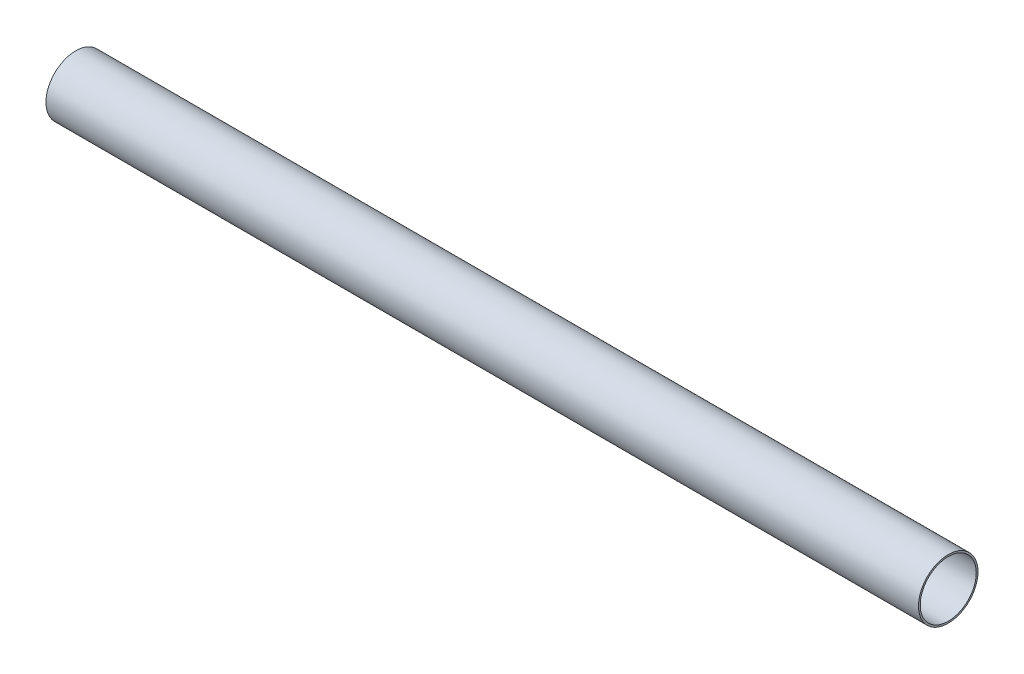
ISO-10303-21;
HEADER;
FILE_DESCRIPTION(('STEP AP214'),'2;1');
FILE_NAME('part.step','',(''),(''),'','','');
FILE_SCHEMA(('AUTOMOTIVE_DESIGN { 1 0 10303 214 1 1 1 1 }'));
ENDSEC;
DATA;
#1=APPLICATION_CONTEXT('core data for automotive mechanical design processes');
#2=APPLICATION_PROTOCOL_DEFINITION('international standard','automotive_design',2000,#1);
#3=PRODUCT_CONTEXT('',#1,'mechanical');
#4=PRODUCT('Part','Part','',(#3));
#5=PRODUCT_RELATED_PRODUCT_CATEGORY('part','',(#4));
#6=PRODUCT_DEFINITION_FORMATION('','',#4);
#7=PRODUCT_DEFINITION_CONTEXT('part definition',#1,'design');
#8=PRODUCT_DEFINITION('design','',#6,#7);
#9=PRODUCT_DEFINITION_SHAPE('','',#8);
#10=(LENGTH_UNIT() NAMED_UNIT(*) SI_UNIT(.MILLI.,.METRE.));
#11=(NAMED_UNIT(*) PLANE_ANGLE_UNIT() SI_UNIT($,.RADIAN.));
#12=(NAMED_UNIT(*) SI_UNIT($,.STERADIAN.) SOLID_ANGLE_UNIT());
#13=UNCERTAINTY_MEASURE_WITH_UNIT(LENGTH_MEASURE(1.E-05),#10,'distance_accuracy_value','');
#14=(GEOMETRIC_REPRESENTATION_CONTEXT(3) GLOBAL_UNCERTAINTY_ASSIGNED_CONTEXT((#13)) GLOBAL_UNIT_ASSIGNED_CONTEXT((#10,
#11,#12)) REPRESENTATION_CONTEXT('',''));
#15=CARTESIAN_POINT('',(0.,0.,0.));
#16=DIRECTION('',(0.,0.,1.));
#17=DIRECTION('',(1.,0.,0.));
#18=AXIS2_PLACEMENT_3D('',#15,#16,#17);
#19=CARTESIAN_POINT('',(-2500.,0.,0.));
#20=DIRECTION('',(1.,0.,0.));
#21=DIRECTION('',(0.,0.,-1.));
#22=AXIS2_PLACEMENT_3D('',#19,#20,#21);
#23=CYLINDRICAL_SURFACE('',#22,170.5);
#24=CARTESIAN_POINT('',(-2500.,0.,0.));
#25=DIRECTION('',(1.,0.,0.));
#26=DIRECTION('',(0.,0.,-1.));
#27=AXIS2_PLACEMENT_3D('',#24,#25,#26);
#28=CIRCLE('',#27,170.5);
#29=CARTESIAN_POINT('',(-2500.,0.,-170.5));
#30=VERTEX_POINT('',#29);
#31=EDGE_CURVE('E10',#30,#30,#28,.T.);
#32=ORIENTED_EDGE('',*,*,#31,.T.);
#33=EDGE_LOOP('',(#32));
#34=FACE_BOUND('',#33,.T.);
#35=CARTESIAN_POINT('',(2500.,0.,0.));
#36=DIRECTION('',(1.,0.,0.));
#37=DIRECTION('',(0.,0.,-1.));
#38=AXIS2_PLACEMENT_3D('',#35,#36,#37);
#39=CIRCLE('',#38,170.5);
#40=CARTESIAN_POINT('',(2500.,0.,-170.5));
#41=VERTEX_POINT('',#40);
#42=EDGE_CURVE('E54',#41,#41,#39,.T.);
#43=ORIENTED_EDGE('',*,*,#42,.F.);
#44=EDGE_LOOP('',(#43));
#45=FACE_BOUND('',#44,.T.);
#46=ADVANCED_FACE('F47',(#34,#45),#23,.T.);
#47=CARTESIAN_POINT('',(-2500.,0.,0.));
#48=DIRECTION('',(1.,0.,0.));
#49=DIRECTION('',(0.,0.,-1.));
#50=AXIS2_PLACEMENT_3D('',#47,#48,#49);
#51=PLANE('',#50);
#52=CARTESIAN_POINT('',(-2500.,0.,0.));
#53=DIRECTION('',(1.,0.,0.));
#54=DIRECTION('',(0.,0.,-1.));
#55=AXIS2_PLACEMENT_3D('',#52,#53,#54);
#56=CIRCLE('',#55,160.5);
#57=CARTESIAN_POINT('',(-2500.,0.,-160.5));
#58=VERTEX_POINT('',#57);
#59=EDGE_CURVE('E61',#58,#58,#56,.T.);
#60=ORIENTED_EDGE('',*,*,#59,.T.);
#61=EDGE_LOOP('',(#60));
#62=FACE_BOUND('',#61,.T.);
#63=ORIENTED_EDGE('',*,*,#31,.F.);
#64=EDGE_LOOP('',(#63));
#65=FACE_BOUND('',#64,.T.);
#66=ADVANCED_FACE('F78',(#62,#65),#51,.F.);
#67=CARTESIAN_POINT('',(2500.,0.,0.));
#68=DIRECTION('',(1.,0.,0.));
#69=DIRECTION('',(0.,0.,-1.));
#70=AXIS2_PLACEMENT_3D('',#67,#68,#69);
#71=PLANE('',#70);
#72=CARTESIAN_POINT('',(2500.,0.,0.));
#73=DIRECTION('',(1.,0.,0.));
#74=DIRECTION('',(0.,0.,-1.));
#75=AXIS2_PLACEMENT_3D('',#72,#73,#74);
#76=CIRCLE('',#75,160.5);
#77=CARTESIAN_POINT('',(2500.,0.,-160.5));
#78=VERTEX_POINT('',#77);
#79=EDGE_CURVE('E66',#78,#78,#76,.T.);
#80=ORIENTED_EDGE('',*,*,#79,.F.);
#81=EDGE_LOOP('',(#80));
#82=FACE_BOUND('',#81,.T.);
#83=ORIENTED_EDGE('',*,*,#42,.T.);
#84=EDGE_LOOP('',(#83));
#85=FACE_BOUND('',#84,.T.);
#86=ADVANCED_FACE('F76',(#82,#85),#71,.T.);
#87=CARTESIAN_POINT('',(-2500.,0.,0.));
#88=DIRECTION('',(1.,0.,0.));
#89=DIRECTION('',(0.,0.,-1.));
#90=AXIS2_PLACEMENT_3D('',#87,#88,#89);
#91=CYLINDRICAL_SURFACE('',#90,160.5);
#92=ORIENTED_EDGE('',*,*,#59,.F.);
#93=EDGE_LOOP('',(#92));
#94=FACE_BOUND('',#93,.T.);
#95=ORIENTED_EDGE('',*,*,#79,.T.);
#96=EDGE_LOOP('',(#95));
#97=FACE_BOUND('',#96,.T.);
#98=ADVANCED_FACE('F74',(#94,#97),#91,.F.);
#99=CLOSED_SHELL('',(#46,#66,#86,#98));
#100=MANIFOLD_SOLID_BREP('B2',#99);
#101=ADVANCED_BREP_SHAPE_REPRESENTATION('',(#18,#100),#14);
#102=SHAPE_DEFINITION_REPRESENTATION(#9,#101);
ENDSEC;
END-ISO-10303-21;
